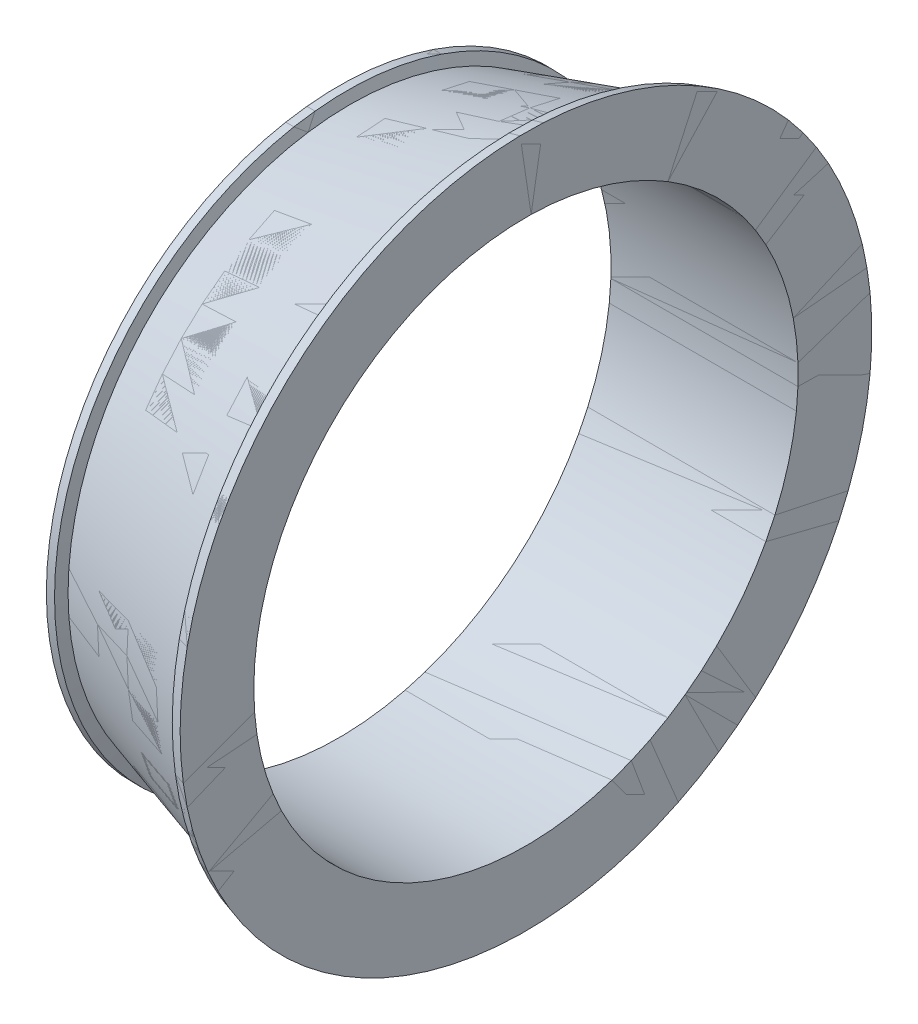
ISO-10303-21;
HEADER;
FILE_DESCRIPTION(('STEP AP214'),'2;1');
FILE_NAME('part.step','',(''),(''),'','','');
FILE_SCHEMA(('AUTOMOTIVE_DESIGN { 1 0 10303 214 1 1 1 1 }'));
ENDSEC;
DATA;
#1=APPLICATION_CONTEXT('core data for automotive mechanical design processes');
#2=APPLICATION_PROTOCOL_DEFINITION('international standard','automotive_design',2000,#1);
#3=PRODUCT_CONTEXT('',#1,'mechanical');
#4=PRODUCT('Part','Part','',(#3));
#5=PRODUCT_RELATED_PRODUCT_CATEGORY('part','',(#4));
#6=PRODUCT_DEFINITION_FORMATION('','',#4);
#7=PRODUCT_DEFINITION_CONTEXT('part definition',#1,'design');
#8=PRODUCT_DEFINITION('design','',#6,#7);
#9=PRODUCT_DEFINITION_SHAPE('','',#8);
#10=(LENGTH_UNIT() NAMED_UNIT(*) SI_UNIT(.MILLI.,.METRE.));
#11=(NAMED_UNIT(*) PLANE_ANGLE_UNIT() SI_UNIT($,.RADIAN.));
#12=(NAMED_UNIT(*) SI_UNIT($,.STERADIAN.) SOLID_ANGLE_UNIT());
#13=UNCERTAINTY_MEASURE_WITH_UNIT(LENGTH_MEASURE(1.E-05),#10,'distance_accuracy_value','');
#14=(GEOMETRIC_REPRESENTATION_CONTEXT(3) GLOBAL_UNCERTAINTY_ASSIGNED_CONTEXT((#13)) GLOBAL_UNIT_ASSIGNED_CONTEXT((#10,
#11,#12)) REPRESENTATION_CONTEXT('',''));
#15=CARTESIAN_POINT('',(0.,0.,0.));
#16=DIRECTION('',(0.,0.,1.));
#17=DIRECTION('',(1.,0.,0.));
#18=AXIS2_PLACEMENT_3D('',#15,#16,#17);
#19=CARTESIAN_POINT('',(-45.0178940391938,0.,0.));
#20=DIRECTION('',(-1.,0.,0.));
#21=DIRECTION('',(0.,0.,1.));
#22=AXIS2_PLACEMENT_3D('',#19,#20,#21);
#23=CYLINDRICAL_SURFACE('',#22,27.3005783747104);
#24=CARTESIAN_POINT('',(-8.73124999999999,0.,0.));
#25=DIRECTION('',(-1.,0.,0.));
#26=DIRECTION('',(0.,0.,1.));
#27=AXIS2_PLACEMENT_3D('',#24,#25,#26);
#28=CIRCLE('',#27,27.3005783747104);
#29=CARTESIAN_POINT('',(-8.73124999999999,0.,27.3005783747104));
#30=VERTEX_POINT('',#29);
#31=EDGE_CURVE('E11',#30,#30,#28,.T.);
#32=ORIENTED_EDGE('',*,*,#31,.F.);
#33=EDGE_LOOP('',(#32));
#34=FACE_BOUND('',#33,.T.);
#35=CARTESIAN_POINT('',(-7.96924999999999,0.,0.));
#36=DIRECTION('',(-1.,0.,0.));
#37=DIRECTION('',(0.,0.,1.));
#38=AXIS2_PLACEMENT_3D('',#35,#36,#37);
#39=CIRCLE('',#38,27.3005783747104);
#40=CARTESIAN_POINT('',(-7.96924999999999,0.,27.3005783747104));
#41=VERTEX_POINT('',#40);
#42=EDGE_CURVE('E67',#41,#41,#39,.T.);
#43=ORIENTED_EDGE('',*,*,#42,.T.);
#44=EDGE_LOOP('',(#43));
#45=FACE_BOUND('',#44,.T.);
#46=ADVANCED_FACE('F39',(#34,#45),#23,.T.);
#47=CARTESIAN_POINT('',(-8.73124999999999,25.4,0.));
#48=DIRECTION('',(1.,0.,0.));
#49=DIRECTION('',(0.,0.,-1.));
#50=AXIS2_PLACEMENT_3D('',#47,#48,#49);
#51=PLANE('',#50);
#52=CARTESIAN_POINT('',(-8.73124999999999,0.,0.));
#53=DIRECTION('',(-1.,0.,0.));
#54=DIRECTION('',(0.,0.,1.));
#55=AXIS2_PLACEMENT_3D('',#52,#53,#54);
#56=CIRCLE('',#55,25.4);
#57=CARTESIAN_POINT('',(-8.73124999999999,0.,25.4));
#58=VERTEX_POINT('',#57);
#59=EDGE_CURVE('E45',#58,#58,#56,.T.);
#60=ORIENTED_EDGE('',*,*,#59,.F.);
#61=EDGE_LOOP('',(#60));
#62=FACE_BOUND('',#61,.T.);
#63=ORIENTED_EDGE('',*,*,#31,.T.);
#64=EDGE_LOOP('',(#63));
#65=FACE_BOUND('',#64,.T.);
#66=ADVANCED_FACE('F104',(#62,#65),#51,.F.);
#67=CARTESIAN_POINT('',(-45.0178940391938,0.,0.));
#68=DIRECTION('',(-1.,0.,0.));
#69=DIRECTION('',(0.,0.,1.));
#70=AXIS2_PLACEMENT_3D('',#67,#68,#69);
#71=CYLINDRICAL_SURFACE('',#70,25.4);
#72=CARTESIAN_POINT('',(8.73125,0.,0.));
#73=DIRECTION('',(-1.,0.,0.));
#74=DIRECTION('',(0.,0.,1.));
#75=AXIS2_PLACEMENT_3D('',#72,#73,#74);
#76=CIRCLE('',#75,25.4);
#77=CARTESIAN_POINT('',(8.73125,0.,25.4));
#78=VERTEX_POINT('',#77);
#79=EDGE_CURVE('E49',#78,#78,#76,.T.);
#80=ORIENTED_EDGE('',*,*,#79,.F.);
#81=EDGE_LOOP('',(#80));
#82=FACE_BOUND('',#81,.T.);
#83=ORIENTED_EDGE('',*,*,#59,.T.);
#84=EDGE_LOOP('',(#83));
#85=FACE_BOUND('',#84,.T.);
#86=ADVANCED_FACE('F99',(#82,#85),#71,.F.);
#87=CARTESIAN_POINT('',(8.73124999999999,25.4,0.));
#88=DIRECTION('',(-1.,0.,0.));
#89=DIRECTION('',(0.,0.,1.));
#90=AXIS2_PLACEMENT_3D('',#87,#88,#89);
#91=PLANE('',#90);
#92=CARTESIAN_POINT('',(8.73124999999998,0.,0.));
#93=DIRECTION('',(-1.,0.,0.));
#94=DIRECTION('',(0.,0.,1.));
#95=AXIS2_PLACEMENT_3D('',#92,#93,#94);
#96=CIRCLE('',#95,32.2783540963535);
#97=CARTESIAN_POINT('',(8.73124999999998,0.,32.2783540963535));
#98=VERTEX_POINT('',#97);
#99=EDGE_CURVE('E53',#98,#98,#96,.T.);
#100=ORIENTED_EDGE('',*,*,#99,.F.);
#101=EDGE_LOOP('',(#100));
#102=FACE_BOUND('',#101,.T.);
#103=ORIENTED_EDGE('',*,*,#79,.T.);
#104=EDGE_LOOP('',(#103));
#105=FACE_BOUND('',#104,.T.);
#106=ADVANCED_FACE('F93',(#102,#105),#91,.F.);
#107=CARTESIAN_POINT('',(8.73124999999998,0.,0.));
#108=DIRECTION('',(1.,0.,0.));
#109=DIRECTION('',(0.,0.,-1.));
#110=AXIS2_PLACEMENT_3D('',#107,#108,#109);
#111=CONICAL_SURFACE('',#110,32.2783540963535,0.292346912270899);
#112=CARTESIAN_POINT('',(7.67921154166477,0.,0.));
#113=DIRECTION('',(-1.,0.,0.));
#114=DIRECTION('',(0.,0.,1.));
#115=AXIS2_PLACEMENT_3D('',#112,#113,#114);
#116=CIRCLE('',#115,31.9617215683585);
#117=CARTESIAN_POINT('',(7.67921154166477,0.,31.9617215683585));
#118=VERTEX_POINT('',#117);
#119=EDGE_CURVE('E58',#118,#118,#116,.T.);
#120=ORIENTED_EDGE('',*,*,#119,.F.);
#121=EDGE_LOOP('',(#120));
#122=FACE_BOUND('',#121,.T.);
#123=ORIENTED_EDGE('',*,*,#99,.T.);
#124=EDGE_LOOP('',(#123));
#125=FACE_BOUND('',#124,.T.);
#126=ADVANCED_FACE('F87',(#122,#125),#111,.T.);
#127=CARTESIAN_POINT('',(7.67921154166477,0.,0.));
#128=DIRECTION('',(-1.,0.,0.));
#129=DIRECTION('',(0.,0.,1.));
#130=AXIS2_PLACEMENT_3D('',#127,#128,#129);
#131=CONICAL_SURFACE('',#130,31.9617215683585,1.28129856376658);
#132=CARTESIAN_POINT('',(7.96925,0.,0.));
#133=DIRECTION('',(-1.,0.,0.));
#134=DIRECTION('',(0.,0.,1.));
#135=AXIS2_PLACEMENT_3D('',#132,#133,#134);
#136=CIRCLE('',#135,30.9880000000001);
#137=CARTESIAN_POINT('',(7.96925,0.,30.9880000000001));
#138=VERTEX_POINT('',#137);
#139=EDGE_CURVE('E61',#138,#138,#136,.T.);
#140=ORIENTED_EDGE('',*,*,#139,.F.);
#141=EDGE_LOOP('',(#140));
#142=FACE_BOUND('',#141,.T.);
#143=ORIENTED_EDGE('',*,*,#119,.T.);
#144=EDGE_LOOP('',(#143));
#145=FACE_BOUND('',#144,.T.);
#146=ADVANCED_FACE('F81',(#142,#145),#131,.F.);
#147=CARTESIAN_POINT('',(7.96925,0.,0.));
#148=DIRECTION('',(1.,0.,0.));
#149=DIRECTION('',(0.,0.,-1.));
#150=AXIS2_PLACEMENT_3D('',#147,#148,#149);
#151=CONICAL_SURFACE('',#150,30.9880000000001,0.289497763028293);
#152=CARTESIAN_POINT('',(-7.67921154166476,0.,0.));
#153=DIRECTION('',(-1.,0.,0.));
#154=DIRECTION('',(0.,0.,1.));
#155=AXIS2_PLACEMENT_3D('',#152,#153,#154);
#156=CIRCLE('',#155,26.3268568063519);
#157=CARTESIAN_POINT('',(-7.67921154166476,0.,26.3268568063519));
#158=VERTEX_POINT('',#157);
#159=EDGE_CURVE('E64',#158,#158,#156,.T.);
#160=ORIENTED_EDGE('',*,*,#159,.F.);
#161=EDGE_LOOP('',(#160));
#162=FACE_BOUND('',#161,.T.);
#163=ORIENTED_EDGE('',*,*,#139,.T.);
#164=EDGE_LOOP('',(#163));
#165=FACE_BOUND('',#164,.T.);
#166=ADVANCED_FACE('F75',(#162,#165),#151,.T.);
#167=CARTESIAN_POINT('',(-7.67921154166476,0.,0.));
#168=DIRECTION('',(-1.,0.,0.));
#169=DIRECTION('',(0.,0.,1.));
#170=AXIS2_PLACEMENT_3D('',#167,#168,#169);
#171=CONICAL_SURFACE('',#170,26.3268568063519,1.2812985637666);
#172=ORIENTED_EDGE('',*,*,#42,.F.);
#173=EDGE_LOOP('',(#172));
#174=FACE_BOUND('',#173,.T.);
#175=ORIENTED_EDGE('',*,*,#159,.T.);
#176=EDGE_LOOP('',(#175));
#177=FACE_BOUND('',#176,.T.);
#178=ADVANCED_FACE('F72',(#174,#177),#171,.T.);
#179=CLOSED_SHELL('',(#46,#66,#86,#106,#126,#146,#166,#178));
#180=MANIFOLD_SOLID_BREP('B2',#179);
#181=CARTESIAN_POINT('',(-7.67921154166479,0.,0.));
#182=DIRECTION('',(1.,0.,0.));
#183=DIRECTION('',(0.,0.,-1.));
#184=AXIS2_PLACEMENT_3D('',#181,#182,#183);
#185=CONICAL_SURFACE('',#184,26.3268568063519,0.289497763028293);
#186=CARTESIAN_POINT('',(7.96924999999998,0.,0.));
#187=DIRECTION('',(-1.,0.,0.));
#188=DIRECTION('',(0.,0.,1.));
#189=AXIS2_PLACEMENT_3D('',#186,#187,#188);
#190=CIRCLE('',#189,30.9880000000001);
#191=CARTESIAN_POINT('',(7.96924999999998,0.,30.9880000000001));
#192=VERTEX_POINT('',#191);
#193=EDGE_CURVE('E189',#192,#192,#190,.T.);
#194=ORIENTED_EDGE('',*,*,#193,.T.);
#195=EDGE_LOOP('',(#194));
#196=FACE_BOUND('',#195,.T.);
#197=CARTESIAN_POINT('',(-7.67921154166479,0.,0.));
#198=DIRECTION('',(-1.,0.,0.));
#199=DIRECTION('',(0.,0.,1.));
#200=AXIS2_PLACEMENT_3D('',#197,#198,#199);
#201=CIRCLE('',#200,26.3268568063519);
#202=CARTESIAN_POINT('',(-7.67921154166479,0.,26.3268568063519));
#203=VERTEX_POINT('',#202);
#204=EDGE_CURVE('E38',#203,#203,#201,.T.);
#205=ORIENTED_EDGE('',*,*,#204,.F.);
#206=EDGE_LOOP('',(#205));
#207=FACE_BOUND('',#206,.T.);
#208=ADVANCED_FACE('F161',(#196,#207),#185,.T.);
#209=CARTESIAN_POINT('',(-7.96925000000002,0.,0.));
#210=DIRECTION('',(-1.,0.,0.));
#211=DIRECTION('',(0.,0.,1.));
#212=AXIS2_PLACEMENT_3D('',#209,#210,#211);
#213=CONICAL_SURFACE('',#212,27.3005783747104,1.2812985637666);
#214=ORIENTED_EDGE('',*,*,#204,.T.);
#215=EDGE_LOOP('',(#214));
#216=FACE_BOUND('',#215,.T.);
#217=CARTESIAN_POINT('',(-7.96925000000002,0.,0.));
#218=DIRECTION('',(-1.,0.,0.));
#219=DIRECTION('',(0.,0.,1.));
#220=AXIS2_PLACEMENT_3D('',#217,#218,#219);
#221=CIRCLE('',#220,27.3005783747104);
#222=CARTESIAN_POINT('',(-7.96925000000002,0.,27.3005783747104));
#223=VERTEX_POINT('',#222);
#224=EDGE_CURVE('E167',#223,#223,#221,.T.);
#225=ORIENTED_EDGE('',*,*,#224,.F.);
#226=EDGE_LOOP('',(#225));
#227=FACE_BOUND('',#226,.T.);
#228=ADVANCED_FACE('F207',(#216,#227),#213,.T.);
#229=CARTESIAN_POINT('',(-45.0178940391938,0.,0.));
#230=DIRECTION('',(-1.,0.,0.));
#231=DIRECTION('',(0.,0.,1.));
#232=AXIS2_PLACEMENT_3D('',#229,#230,#231);
#233=CYLINDRICAL_SURFACE('',#232,27.3005783747104);
#234=ORIENTED_EDGE('',*,*,#224,.T.);
#235=EDGE_LOOP('',(#234));
#236=FACE_BOUND('',#235,.T.);
#237=CARTESIAN_POINT('',(-8.73125000000002,0.,0.));
#238=DIRECTION('',(-1.,0.,0.));
#239=DIRECTION('',(0.,0.,1.));
#240=AXIS2_PLACEMENT_3D('',#237,#238,#239);
#241=CIRCLE('',#240,27.3005783747104);
#242=CARTESIAN_POINT('',(-8.73125000000002,0.,27.3005783747104));
#243=VERTEX_POINT('',#242);
#244=EDGE_CURVE('E171',#243,#243,#241,.T.);
#245=ORIENTED_EDGE('',*,*,#244,.F.);
#246=EDGE_LOOP('',(#245));
#247=FACE_BOUND('',#246,.T.);
#248=ADVANCED_FACE('F211',(#236,#247),#233,.T.);
#249=CARTESIAN_POINT('',(-8.73125000000002,-25.4,0.));
#250=DIRECTION('',(-1.,0.,0.));
#251=DIRECTION('',(0.,0.,1.));
#252=AXIS2_PLACEMENT_3D('',#249,#250,#251);
#253=PLANE('',#252);
#254=ORIENTED_EDGE('',*,*,#244,.T.);
#255=EDGE_LOOP('',(#254));
#256=FACE_BOUND('',#255,.T.);
#257=CARTESIAN_POINT('',(-8.73125000000002,0.,0.));
#258=DIRECTION('',(-1.,0.,0.));
#259=DIRECTION('',(0.,0.,1.));
#260=AXIS2_PLACEMENT_3D('',#257,#258,#259);
#261=CIRCLE('',#260,25.4);
#262=CARTESIAN_POINT('',(-8.73125000000002,0.,25.4));
#263=VERTEX_POINT('',#262);
#264=EDGE_CURVE('E175',#263,#263,#261,.T.);
#265=ORIENTED_EDGE('',*,*,#264,.F.);
#266=EDGE_LOOP('',(#265));
#267=FACE_BOUND('',#266,.T.);
#268=ADVANCED_FACE('F215',(#256,#267),#253,.T.);
#269=CARTESIAN_POINT('',(-45.0178940391938,0.,0.));
#270=DIRECTION('',(-1.,0.,0.));
#271=DIRECTION('',(0.,0.,1.));
#272=AXIS2_PLACEMENT_3D('',#269,#270,#271);
#273=CYLINDRICAL_SURFACE('',#272,25.4);
#274=ORIENTED_EDGE('',*,*,#264,.T.);
#275=EDGE_LOOP('',(#274));
#276=FACE_BOUND('',#275,.T.);
#277=CARTESIAN_POINT('',(8.73124999999997,0.,0.));
#278=DIRECTION('',(-1.,0.,0.));
#279=DIRECTION('',(0.,0.,1.));
#280=AXIS2_PLACEMENT_3D('',#277,#278,#279);
#281=CIRCLE('',#280,25.4);
#282=CARTESIAN_POINT('',(8.73124999999997,0.,25.4));
#283=VERTEX_POINT('',#282);
#284=EDGE_CURVE('E180',#283,#283,#281,.T.);
#285=ORIENTED_EDGE('',*,*,#284,.F.);
#286=EDGE_LOOP('',(#285));
#287=FACE_BOUND('',#286,.T.);
#288=ADVANCED_FACE('F221',(#276,#287),#273,.F.);
#289=CARTESIAN_POINT('',(8.73124999999997,-25.4,0.));
#290=DIRECTION('',(1.,0.,0.));
#291=DIRECTION('',(0.,0.,-1.));
#292=AXIS2_PLACEMENT_3D('',#289,#290,#291);
#293=PLANE('',#292);
#294=ORIENTED_EDGE('',*,*,#284,.T.);
#295=EDGE_LOOP('',(#294));
#296=FACE_BOUND('',#295,.T.);
#297=CARTESIAN_POINT('',(8.73124999999995,0.,0.));
#298=DIRECTION('',(-1.,0.,0.));
#299=DIRECTION('',(0.,0.,1.));
#300=AXIS2_PLACEMENT_3D('',#297,#298,#299);
#301=CIRCLE('',#300,32.2783540963535);
#302=CARTESIAN_POINT('',(8.73124999999995,0.,32.2783540963535));
#303=VERTEX_POINT('',#302);
#304=EDGE_CURVE('E183',#303,#303,#301,.T.);
#305=ORIENTED_EDGE('',*,*,#304,.F.);
#306=EDGE_LOOP('',(#305));
#307=FACE_BOUND('',#306,.T.);
#308=ADVANCED_FACE('F203',(#296,#307),#293,.T.);
#309=CARTESIAN_POINT('',(7.67921154166475,0.,0.));
#310=DIRECTION('',(1.,0.,0.));
#311=DIRECTION('',(0.,0.,-1.));
#312=AXIS2_PLACEMENT_3D('',#309,#310,#311);
#313=CONICAL_SURFACE('',#312,31.9617215683585,0.292346912270899);
#314=ORIENTED_EDGE('',*,*,#304,.T.);
#315=EDGE_LOOP('',(#314));
#316=FACE_BOUND('',#315,.T.);
#317=CARTESIAN_POINT('',(7.67921154166475,0.,0.));
#318=DIRECTION('',(-1.,0.,0.));
#319=DIRECTION('',(0.,0.,1.));
#320=AXIS2_PLACEMENT_3D('',#317,#318,#319);
#321=CIRCLE('',#320,31.9617215683585);
#322=CARTESIAN_POINT('',(7.67921154166475,0.,31.9617215683585));
#323=VERTEX_POINT('',#322);
#324=EDGE_CURVE('E186',#323,#323,#321,.T.);
#325=ORIENTED_EDGE('',*,*,#324,.F.);
#326=EDGE_LOOP('',(#325));
#327=FACE_BOUND('',#326,.T.);
#328=ADVANCED_FACE('F197',(#316,#327),#313,.T.);
#329=CARTESIAN_POINT('',(7.96924999999998,0.,0.));
#330=DIRECTION('',(-1.,0.,0.));
#331=DIRECTION('',(0.,0.,1.));
#332=AXIS2_PLACEMENT_3D('',#329,#330,#331);
#333=CONICAL_SURFACE('',#332,30.9880000000001,1.28129856376658);
#334=ORIENTED_EDGE('',*,*,#324,.T.);
#335=EDGE_LOOP('',(#334));
#336=FACE_BOUND('',#335,.T.);
#337=ORIENTED_EDGE('',*,*,#193,.F.);
#338=EDGE_LOOP('',(#337));
#339=FACE_BOUND('',#338,.T.);
#340=ADVANCED_FACE('F195',(#336,#339),#333,.F.);
#341=CLOSED_SHELL('',(#208,#228,#248,#268,#288,#308,#328,#340));
#342=MANIFOLD_SOLID_BREP('B6',#341);
#343=ADVANCED_BREP_SHAPE_REPRESENTATION('',(#18,#180,#342),#14);
#344=SHAPE_DEFINITION_REPRESENTATION(#9,#343);
ENDSEC;
END-ISO-10303-21;
